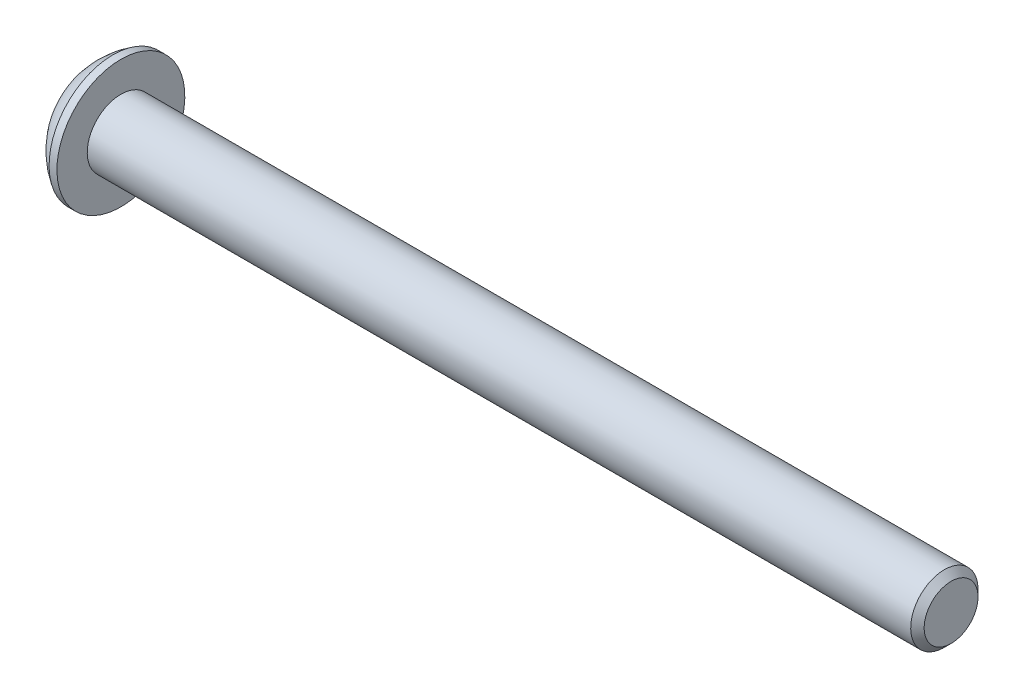
ISO-10303-21;
HEADER;
FILE_DESCRIPTION(('STEP AP214'),'2;1');
FILE_NAME('part.step','',(''),(''),'','','');
FILE_SCHEMA(('AUTOMOTIVE_DESIGN { 1 0 10303 214 1 1 1 1 }'));
ENDSEC;
DATA;
#1=APPLICATION_CONTEXT('core data for automotive mechanical design processes');
#2=APPLICATION_PROTOCOL_DEFINITION('international standard','automotive_design',2000,#1);
#3=PRODUCT_CONTEXT('',#1,'mechanical');
#4=PRODUCT('Part','Part','',(#3));
#5=PRODUCT_RELATED_PRODUCT_CATEGORY('part','',(#4));
#6=PRODUCT_DEFINITION_FORMATION('','',#4);
#7=PRODUCT_DEFINITION_CONTEXT('part definition',#1,'design');
#8=PRODUCT_DEFINITION('design','',#6,#7);
#9=PRODUCT_DEFINITION_SHAPE('','',#8);
#10=(LENGTH_UNIT() NAMED_UNIT(*) SI_UNIT(.MILLI.,.METRE.));
#11=(NAMED_UNIT(*) PLANE_ANGLE_UNIT() SI_UNIT($,.RADIAN.));
#12=(NAMED_UNIT(*) SI_UNIT($,.STERADIAN.) SOLID_ANGLE_UNIT());
#13=UNCERTAINTY_MEASURE_WITH_UNIT(LENGTH_MEASURE(1.E-05),#10,'distance_accuracy_value','');
#14=(GEOMETRIC_REPRESENTATION_CONTEXT(3) GLOBAL_UNCERTAINTY_ASSIGNED_CONTEXT((#13)) GLOBAL_UNIT_ASSIGNED_CONTEXT((#10,
#11,#12)) REPRESENTATION_CONTEXT('',''));
#15=CARTESIAN_POINT('',(0.,0.,0.));
#16=DIRECTION('',(0.,0.,1.));
#17=DIRECTION('',(1.,0.,0.));
#18=AXIS2_PLACEMENT_3D('',#15,#16,#17);
#19=CARTESIAN_POINT('',(0.,0.,0.));
#20=DIRECTION('',(-1.,0.,0.));
#21=DIRECTION('',(0.,-1.,0.));
#22=AXIS2_PLACEMENT_3D('',#19,#20,#21);
#23=PLANE('',#22);
#24=DIRECTION('',(0.,0.5,-0.866025403784439));
#25=VECTOR('',#24,1.);
#26=CARTESIAN_POINT('',(0.,0.577350269189626,1.));
#27=LINE('',#26,#25);
#28=CARTESIAN_POINT('',(0.,0.577350269189626,1.));
#29=VERTEX_POINT('',#28);
#30=CARTESIAN_POINT('',(0.,1.15470053837925,0.));
#31=VERTEX_POINT('',#30);
#32=EDGE_CURVE('E53',#29,#31,#27,.T.);
#33=ORIENTED_EDGE('',*,*,#32,.F.);
#34=DIRECTION('',(0.,1.,0.));
#35=VECTOR('',#34,1.);
#36=CARTESIAN_POINT('',(0.,-0.577350269189626,1.));
#37=LINE('',#36,#35);
#38=CARTESIAN_POINT('',(0.,-0.577350269189626,1.));
#39=VERTEX_POINT('',#38);
#40=EDGE_CURVE('E146',#39,#29,#37,.T.);
#41=ORIENTED_EDGE('',*,*,#40,.F.);
#42=DIRECTION('',(0.,0.5,0.866025403784439));
#43=VECTOR('',#42,1.);
#44=CARTESIAN_POINT('',(0.,-1.15470053837925,0.));
#45=LINE('',#44,#43);
#46=CARTESIAN_POINT('',(0.,-1.15470053837925,0.));
#47=VERTEX_POINT('',#46);
#48=EDGE_CURVE('E143',#47,#39,#45,.T.);
#49=ORIENTED_EDGE('',*,*,#48,.F.);
#50=DIRECTION('',(0.,-0.5,0.866025403784439));
#51=VECTOR('',#50,1.);
#52=CARTESIAN_POINT('',(0.,-0.577350269189626,-1.));
#53=LINE('',#52,#51);
#54=CARTESIAN_POINT('',(0.,-0.577350269189626,-1.));
#55=VERTEX_POINT('',#54);
#56=EDGE_CURVE('E101',#55,#47,#53,.T.);
#57=ORIENTED_EDGE('',*,*,#56,.F.);
#58=DIRECTION('',(0.,-1.,0.));
#59=VECTOR('',#58,1.);
#60=CARTESIAN_POINT('',(0.,0.577350269189626,-1.));
#61=LINE('',#60,#59);
#62=CARTESIAN_POINT('',(0.,0.577350269189626,-1.));
#63=VERTEX_POINT('',#62);
#64=EDGE_CURVE('E137',#63,#55,#61,.T.);
#65=ORIENTED_EDGE('',*,*,#64,.F.);
#66=DIRECTION('',(0.,-0.5,-0.866025403784439));
#67=VECTOR('',#66,1.);
#68=CARTESIAN_POINT('',(0.,1.15470053837925,0.));
#69=LINE('',#68,#67);
#70=EDGE_CURVE('E133',#31,#63,#69,.T.);
#71=ORIENTED_EDGE('',*,*,#70,.F.);
#72=EDGE_LOOP('',(#33,#41,#49,#57,#65,#71));
#73=FACE_BOUND('',#72,.T.);
#74=CARTESIAN_POINT('',(0.,0.,0.));
#75=DIRECTION('',(1.,0.,0.));
#76=DIRECTION('',(0.,1.,0.));
#77=AXIS2_PLACEMENT_3D('',#74,#75,#76);
#78=CIRCLE('',#77,1.425);
#79=CARTESIAN_POINT('',(0.,1.425,0.));
#80=VERTEX_POINT('',#79);
#81=EDGE_CURVE('E11',#80,#80,#78,.T.);
#82=ORIENTED_EDGE('',*,*,#81,.F.);
#83=EDGE_LOOP('',(#82));
#84=FACE_BOUND('',#83,.T.);
#85=ADVANCED_FACE('F38',(#73,#84),#23,.T.);
#86=CARTESIAN_POINT('',(3.02008573133697,0.,0.));
#87=DIRECTION('',(1.,0.,0.));
#88=DIRECTION('',(0.,1.,0.));
#89=AXIS2_PLACEMENT_3D('',#86,#87,#88);
#90=DEGENERATE_TOROIDAL_SURFACE('',#89,0.0246834742021568,3.35,.F.);
#91=ORIENTED_EDGE('',*,*,#81,.T.);
#92=EDGE_LOOP('',(#91));
#93=FACE_BOUND('',#92,.T.);
#94=CARTESIAN_POINT('',(1.3,0.,0.));
#95=DIRECTION('',(1.,0.,0.));
#96=DIRECTION('',(0.,1.,0.));
#97=AXIS2_PLACEMENT_3D('',#94,#95,#96);
#98=CIRCLE('',#97,2.84999999999999);
#99=CARTESIAN_POINT('',(1.3,2.84999999999999,0.));
#100=VERTEX_POINT('',#99);
#101=EDGE_CURVE('E46',#100,#100,#98,.T.);
#102=ORIENTED_EDGE('',*,*,#101,.F.);
#103=EDGE_LOOP('',(#102));
#104=FACE_BOUND('',#103,.T.);
#105=ADVANCED_FACE('F183',(#93,#104),#90,.F.);
#106=CARTESIAN_POINT('',(38.65,0.,0.));
#107=DIRECTION('',(1.,0.,0.));
#108=DIRECTION('',(0.,1.,0.));
#109=AXIS2_PLACEMENT_3D('',#106,#107,#108);
#110=CYLINDRICAL_SURFACE('',#109,2.84999999999999);
#111=ORIENTED_EDGE('',*,*,#101,.T.);
#112=EDGE_LOOP('',(#111));
#113=FACE_BOUND('',#112,.T.);
#114=CARTESIAN_POINT('',(1.65,0.,0.));
#115=DIRECTION('',(1.,0.,0.));
#116=DIRECTION('',(0.,1.,0.));
#117=AXIS2_PLACEMENT_3D('',#114,#115,#116);
#118=CIRCLE('',#117,2.85);
#119=CARTESIAN_POINT('',(1.65,2.85,0.));
#120=VERTEX_POINT('',#119);
#121=EDGE_CURVE('E173',#120,#120,#118,.T.);
#122=ORIENTED_EDGE('',*,*,#121,.F.);
#123=EDGE_LOOP('',(#122));
#124=FACE_BOUND('',#123,.T.);
#125=ADVANCED_FACE('F180',(#113,#124),#110,.T.);
#126=CARTESIAN_POINT('',(1.65,2.85,0.));
#127=DIRECTION('',(1.,0.,0.));
#128=DIRECTION('',(0.,1.,0.));
#129=AXIS2_PLACEMENT_3D('',#126,#127,#128);
#130=PLANE('',#129);
#131=ORIENTED_EDGE('',*,*,#121,.T.);
#132=EDGE_LOOP('',(#131));
#133=FACE_BOUND('',#132,.T.);
#134=CARTESIAN_POINT('',(1.65,0.,0.));
#135=DIRECTION('',(1.,0.,0.));
#136=DIRECTION('',(0.,1.,0.));
#137=AXIS2_PLACEMENT_3D('',#134,#135,#136);
#138=CIRCLE('',#137,1.5);
#139=CARTESIAN_POINT('',(1.65,1.5,0.));
#140=VERTEX_POINT('',#139);
#141=EDGE_CURVE('E169',#140,#140,#138,.T.);
#142=ORIENTED_EDGE('',*,*,#141,.F.);
#143=EDGE_LOOP('',(#142));
#144=FACE_BOUND('',#143,.T.);
#145=ADVANCED_FACE('F190',(#133,#144),#130,.T.);
#146=CARTESIAN_POINT('',(38.65,0.,0.));
#147=DIRECTION('',(1.,0.,0.));
#148=DIRECTION('',(0.,1.,0.));
#149=AXIS2_PLACEMENT_3D('',#146,#147,#148);
#150=CYLINDRICAL_SURFACE('',#149,1.5);
#151=ORIENTED_EDGE('',*,*,#141,.T.);
#152=EDGE_LOOP('',(#151));
#153=FACE_BOUND('',#152,.T.);
#154=CARTESIAN_POINT('',(38.35,0.,0.));
#155=DIRECTION('',(1.,0.,0.));
#156=DIRECTION('',(0.,1.,0.));
#157=AXIS2_PLACEMENT_3D('',#154,#155,#156);
#158=CIRCLE('',#157,1.5);
#159=CARTESIAN_POINT('',(38.35,1.5,0.));
#160=VERTEX_POINT('',#159);
#161=EDGE_CURVE('E165',#160,#160,#158,.T.);
#162=ORIENTED_EDGE('',*,*,#161,.F.);
#163=EDGE_LOOP('',(#162));
#164=FACE_BOUND('',#163,.T.);
#165=ADVANCED_FACE('F197',(#153,#164),#150,.T.);
#166=CARTESIAN_POINT('',(38.65,0.,0.));
#167=DIRECTION('',(-1.,0.,0.));
#168=DIRECTION('',(0.,-1.,0.));
#169=AXIS2_PLACEMENT_3D('',#166,#167,#168);
#170=CONICAL_SURFACE('',#169,1.2,0.785398163397446);
#171=ORIENTED_EDGE('',*,*,#161,.T.);
#172=EDGE_LOOP('',(#171));
#173=FACE_BOUND('',#172,.T.);
#174=CARTESIAN_POINT('',(38.65,0.,0.));
#175=DIRECTION('',(1.,0.,0.));
#176=DIRECTION('',(0.,1.,0.));
#177=AXIS2_PLACEMENT_3D('',#174,#175,#176);
#178=CIRCLE('',#177,1.2);
#179=CARTESIAN_POINT('',(38.65,1.2,0.));
#180=VERTEX_POINT('',#179);
#181=EDGE_CURVE('E152',#180,#180,#178,.T.);
#182=ORIENTED_EDGE('',*,*,#181,.F.);
#183=EDGE_LOOP('',(#182));
#184=FACE_BOUND('',#183,.T.);
#185=ADVANCED_FACE('F201',(#173,#184),#170,.T.);
#186=CARTESIAN_POINT('',(38.65,1.2,0.));
#187=DIRECTION('',(1.,0.,0.));
#188=DIRECTION('',(0.,1.,0.));
#189=AXIS2_PLACEMENT_3D('',#186,#187,#188);
#190=PLANE('',#189);
#191=ORIENTED_EDGE('',*,*,#181,.T.);
#192=EDGE_LOOP('',(#191));
#193=FACE_BOUND('',#192,.T.);
#194=ADVANCED_FACE('F205',(#193),#190,.T.);
#195=CARTESIAN_POINT('',(1.,0.577350269189626,1.));
#196=DIRECTION('',(0.,0.866025403784439,0.5));
#197=DIRECTION('',(0.,-0.5,0.866025403784439));
#198=AXIS2_PLACEMENT_3D('',#195,#196,#197);
#199=PLANE('',#198);
#200=ORIENTED_EDGE('',*,*,#32,.T.);
#201=DIRECTION('',(-1.,0.,0.));
#202=VECTOR('',#201,1.);
#203=CARTESIAN_POINT('',(1.,1.15470053837925,0.));
#204=LINE('',#203,#202);
#205=CARTESIAN_POINT('',(1.,1.15470053837925,0.));
#206=VERTEX_POINT('',#205);
#207=EDGE_CURVE('E83',#206,#31,#204,.T.);
#208=ORIENTED_EDGE('',*,*,#207,.F.);
#209=DIRECTION('',(0.,0.5,-0.866025403784439));
#210=VECTOR('',#209,1.);
#211=CARTESIAN_POINT('',(1.,0.577350269189626,1.));
#212=LINE('',#211,#210);
#213=CARTESIAN_POINT('',(1.,0.577350269189626,1.));
#214=VERTEX_POINT('',#213);
#215=EDGE_CURVE('E149',#214,#206,#212,.T.);
#216=ORIENTED_EDGE('',*,*,#215,.F.);
#217=DIRECTION('',(-1.,0.,0.));
#218=VECTOR('',#217,1.);
#219=CARTESIAN_POINT('',(1.,0.577350269189626,1.));
#220=LINE('',#219,#218);
#221=EDGE_CURVE('E61',#214,#29,#220,.T.);
#222=ORIENTED_EDGE('',*,*,#221,.T.);
#223=EDGE_LOOP('',(#200,#208,#216,#222));
#224=FACE_BOUND('',#223,.T.);
#225=ADVANCED_FACE('F209',(#224),#199,.F.);
#226=CARTESIAN_POINT('',(1.,-0.577350269189626,1.));
#227=DIRECTION('',(0.,0.,1.));
#228=DIRECTION('',(0.,-1.,0.));
#229=AXIS2_PLACEMENT_3D('',#226,#227,#228);
#230=PLANE('',#229);
#231=ORIENTED_EDGE('',*,*,#40,.T.);
#232=ORIENTED_EDGE('',*,*,#221,.F.);
#233=DIRECTION('',(0.,1.,0.));
#234=VECTOR('',#233,1.);
#235=CARTESIAN_POINT('',(1.,-0.577350269189626,1.));
#236=LINE('',#235,#234);
#237=CARTESIAN_POINT('',(1.,-0.577350269189626,1.));
#238=VERTEX_POINT('',#237);
#239=EDGE_CURVE('E115',#238,#214,#236,.T.);
#240=ORIENTED_EDGE('',*,*,#239,.F.);
#241=DIRECTION('',(-1.,0.,0.));
#242=VECTOR('',#241,1.);
#243=CARTESIAN_POINT('',(1.,-0.577350269189626,1.));
#244=LINE('',#243,#242);
#245=EDGE_CURVE('E106',#238,#39,#244,.T.);
#246=ORIENTED_EDGE('',*,*,#245,.T.);
#247=EDGE_LOOP('',(#231,#232,#240,#246));
#248=FACE_BOUND('',#247,.T.);
#249=ADVANCED_FACE('F213',(#248),#230,.F.);
#250=CARTESIAN_POINT('',(1.,-1.15470053837925,0.));
#251=DIRECTION('',(0.,-0.866025403784439,0.5));
#252=DIRECTION('',(0.,-0.5,-0.866025403784439));
#253=AXIS2_PLACEMENT_3D('',#250,#251,#252);
#254=PLANE('',#253);
#255=ORIENTED_EDGE('',*,*,#48,.T.);
#256=ORIENTED_EDGE('',*,*,#245,.F.);
#257=DIRECTION('',(0.,0.5,0.866025403784439));
#258=VECTOR('',#257,1.);
#259=CARTESIAN_POINT('',(1.,-1.15470053837925,0.));
#260=LINE('',#259,#258);
#261=CARTESIAN_POINT('',(1.,-1.15470053837925,0.));
#262=VERTEX_POINT('',#261);
#263=EDGE_CURVE('E110',#262,#238,#260,.T.);
#264=ORIENTED_EDGE('',*,*,#263,.F.);
#265=DIRECTION('',(-1.,0.,0.));
#266=VECTOR('',#265,1.);
#267=CARTESIAN_POINT('',(1.,-1.15470053837925,0.));
#268=LINE('',#267,#266);
#269=EDGE_CURVE('E94',#262,#47,#268,.T.);
#270=ORIENTED_EDGE('',*,*,#269,.T.);
#271=EDGE_LOOP('',(#255,#256,#264,#270));
#272=FACE_BOUND('',#271,.T.);
#273=ADVANCED_FACE('F111',(#272),#254,.F.);
#274=CARTESIAN_POINT('',(1.,-0.577350269189626,-1.));
#275=DIRECTION('',(0.,-0.866025403784439,-0.5));
#276=DIRECTION('',(0.,0.5,-0.866025403784439));
#277=AXIS2_PLACEMENT_3D('',#274,#275,#276);
#278=PLANE('',#277);
#279=ORIENTED_EDGE('',*,*,#56,.T.);
#280=ORIENTED_EDGE('',*,*,#269,.F.);
#281=DIRECTION('',(0.,-0.5,0.866025403784439));
#282=VECTOR('',#281,1.);
#283=CARTESIAN_POINT('',(1.,-0.577350269189626,-1.));
#284=LINE('',#283,#282);
#285=CARTESIAN_POINT('',(1.,-0.577350269189626,-1.));
#286=VERTEX_POINT('',#285);
#287=EDGE_CURVE('E98',#286,#262,#284,.T.);
#288=ORIENTED_EDGE('',*,*,#287,.F.);
#289=DIRECTION('',(-1.,0.,0.));
#290=VECTOR('',#289,1.);
#291=CARTESIAN_POINT('',(1.,-0.577350269189626,-1.));
#292=LINE('',#291,#290);
#293=EDGE_CURVE('E107',#286,#55,#292,.T.);
#294=ORIENTED_EDGE('',*,*,#293,.T.);
#295=EDGE_LOOP('',(#279,#280,#288,#294));
#296=FACE_BOUND('',#295,.T.);
#297=ADVANCED_FACE('F96',(#296),#278,.F.);
#298=CARTESIAN_POINT('',(1.,0.577350269189626,-1.));
#299=DIRECTION('',(0.,0.,-1.));
#300=DIRECTION('',(-1.,0.,0.));
#301=AXIS2_PLACEMENT_3D('',#298,#299,#300);
#302=PLANE('',#301);
#303=ORIENTED_EDGE('',*,*,#64,.T.);
#304=ORIENTED_EDGE('',*,*,#293,.F.);
#305=DIRECTION('',(0.,-1.,0.));
#306=VECTOR('',#305,1.);
#307=CARTESIAN_POINT('',(1.,0.577350269189626,-1.));
#308=LINE('',#307,#306);
#309=CARTESIAN_POINT('',(1.,0.577350269189626,-1.));
#310=VERTEX_POINT('',#309);
#311=EDGE_CURVE('E121',#310,#286,#308,.T.);
#312=ORIENTED_EDGE('',*,*,#311,.F.);
#313=DIRECTION('',(-1.,0.,0.));
#314=VECTOR('',#313,1.);
#315=CARTESIAN_POINT('',(1.,0.577350269189626,-1.));
#316=LINE('',#315,#314);
#317=EDGE_CURVE('E157',#310,#63,#316,.T.);
#318=ORIENTED_EDGE('',*,*,#317,.T.);
#319=EDGE_LOOP('',(#303,#304,#312,#318));
#320=FACE_BOUND('',#319,.T.);
#321=ADVANCED_FACE('F217',(#320),#302,.F.);
#322=CARTESIAN_POINT('',(1.,1.15470053837925,0.));
#323=DIRECTION('',(0.,0.866025403784439,-0.5));
#324=DIRECTION('',(0.,0.5,0.866025403784439));
#325=AXIS2_PLACEMENT_3D('',#322,#323,#324);
#326=PLANE('',#325);
#327=ORIENTED_EDGE('',*,*,#70,.T.);
#328=ORIENTED_EDGE('',*,*,#317,.F.);
#329=DIRECTION('',(0.,-0.5,-0.866025403784439));
#330=VECTOR('',#329,1.);
#331=CARTESIAN_POINT('',(1.,1.15470053837925,0.));
#332=LINE('',#331,#330);
#333=EDGE_CURVE('E125',#206,#310,#332,.T.);
#334=ORIENTED_EDGE('',*,*,#333,.F.);
#335=ORIENTED_EDGE('',*,*,#207,.T.);
#336=EDGE_LOOP('',(#327,#328,#334,#335));
#337=FACE_BOUND('',#336,.T.);
#338=ADVANCED_FACE('F214',(#337),#326,.F.);
#339=CARTESIAN_POINT('',(1.,0.,0.));
#340=DIRECTION('',(-1.,0.,0.));
#341=DIRECTION('',(0.,-1.,0.));
#342=AXIS2_PLACEMENT_3D('',#339,#340,#341);
#343=PLANE('',#342);
#344=ORIENTED_EDGE('',*,*,#215,.T.);
#345=ORIENTED_EDGE('',*,*,#333,.T.);
#346=ORIENTED_EDGE('',*,*,#311,.T.);
#347=ORIENTED_EDGE('',*,*,#287,.T.);
#348=ORIENTED_EDGE('',*,*,#263,.T.);
#349=ORIENTED_EDGE('',*,*,#239,.T.);
#350=EDGE_LOOP('',(#344,#345,#346,#347,#348,#349));
#351=FACE_BOUND('',#350,.T.);
#352=ADVANCED_FACE('F118',(#351),#343,.T.);
#353=CLOSED_SHELL('',(#85,#105,#125,#145,#165,#185,#194,#225,#249,#273,#297,#321,#338,#352));
#354=MANIFOLD_SOLID_BREP('B2',#353);
#355=ADVANCED_BREP_SHAPE_REPRESENTATION('',(#18,#354),#14);
#356=SHAPE_DEFINITION_REPRESENTATION(#9,#355);
ENDSEC;
END-ISO-10303-21;
